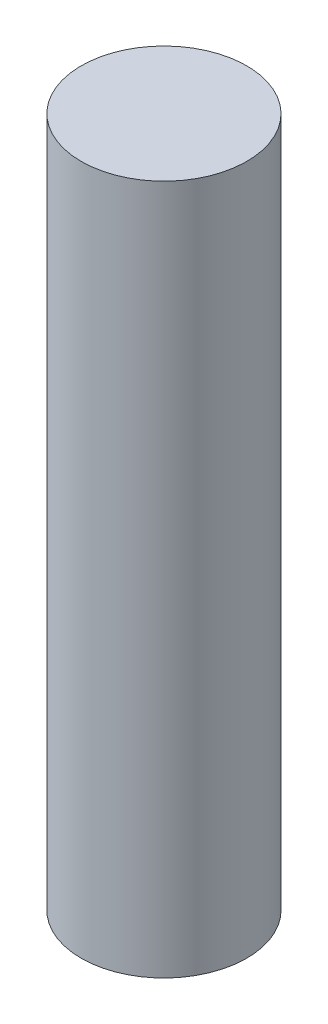
ISO-10303-21;
HEADER;
FILE_DESCRIPTION(('STEP AP214'),'2;1');
FILE_NAME('part.step','',(''),(''),'','','');
FILE_SCHEMA(('AUTOMOTIVE_DESIGN { 1 0 10303 214 1 1 1 1 }'));
ENDSEC;
DATA;
#1=APPLICATION_CONTEXT('core data for automotive mechanical design processes');
#2=APPLICATION_PROTOCOL_DEFINITION('international standard','automotive_design',2000,#1);
#3=PRODUCT_CONTEXT('',#1,'mechanical');
#4=PRODUCT('Part','Part','',(#3));
#5=PRODUCT_RELATED_PRODUCT_CATEGORY('part','',(#4));
#6=PRODUCT_DEFINITION_FORMATION('','',#4);
#7=PRODUCT_DEFINITION_CONTEXT('part definition',#1,'design');
#8=PRODUCT_DEFINITION('design','',#6,#7);
#9=PRODUCT_DEFINITION_SHAPE('','',#8);
#10=(LENGTH_UNIT() NAMED_UNIT(*) SI_UNIT(.MILLI.,.METRE.));
#11=(NAMED_UNIT(*) PLANE_ANGLE_UNIT() SI_UNIT($,.RADIAN.));
#12=(NAMED_UNIT(*) SI_UNIT($,.STERADIAN.) SOLID_ANGLE_UNIT());
#13=UNCERTAINTY_MEASURE_WITH_UNIT(LENGTH_MEASURE(1.E-05),#10,'distance_accuracy_value','');
#14=(GEOMETRIC_REPRESENTATION_CONTEXT(3) GLOBAL_UNCERTAINTY_ASSIGNED_CONTEXT((#13)) GLOBAL_UNIT_ASSIGNED_CONTEXT((#10,
#11,#12)) REPRESENTATION_CONTEXT('',''));
#15=CARTESIAN_POINT('',(0.,0.,0.));
#16=DIRECTION('',(0.,0.,1.));
#17=DIRECTION('',(1.,0.,0.));
#18=AXIS2_PLACEMENT_3D('',#15,#16,#17);
#19=CARTESIAN_POINT('',(0.,20.,0.));
#20=DIRECTION('',(0.,-1.,0.));
#21=DIRECTION('',(0.,0.,-1.));
#22=AXIS2_PLACEMENT_3D('',#19,#20,#21);
#23=CYLINDRICAL_SURFACE('',#22,2.4);
#24=CARTESIAN_POINT('',(0.,20.,0.));
#25=DIRECTION('',(0.,1.,0.));
#26=DIRECTION('',(0.,0.,1.));
#27=AXIS2_PLACEMENT_3D('',#24,#25,#26);
#28=CIRCLE('',#27,2.4);
#29=CARTESIAN_POINT('',(0.,20.,2.4));
#30=VERTEX_POINT('',#29);
#31=EDGE_CURVE('E10',#30,#30,#28,.T.);
#32=ORIENTED_EDGE('',*,*,#31,.F.);
#33=EDGE_LOOP('',(#32));
#34=FACE_BOUND('',#33,.T.);
#35=CARTESIAN_POINT('',(0.,0.,0.));
#36=DIRECTION('',(0.,1.,0.));
#37=DIRECTION('',(0.,0.,1.));
#38=AXIS2_PLACEMENT_3D('',#35,#36,#37);
#39=CIRCLE('',#38,2.4);
#40=CARTESIAN_POINT('',(0.,0.,2.4));
#41=VERTEX_POINT('',#40);
#42=EDGE_CURVE('E34',#41,#41,#39,.T.);
#43=ORIENTED_EDGE('',*,*,#42,.T.);
#44=EDGE_LOOP('',(#43));
#45=FACE_BOUND('',#44,.T.);
#46=ADVANCED_FACE('F31',(#34,#45),#23,.T.);
#47=CARTESIAN_POINT('',(0.,20.,0.));
#48=DIRECTION('',(0.,1.,0.));
#49=DIRECTION('',(0.,0.,1.));
#50=AXIS2_PLACEMENT_3D('',#47,#48,#49);
#51=PLANE('',#50);
#52=ORIENTED_EDGE('',*,*,#31,.T.);
#53=EDGE_LOOP('',(#52));
#54=FACE_BOUND('',#53,.T.);
#55=ADVANCED_FACE('F46',(#54),#51,.T.);
#56=CARTESIAN_POINT('',(0.,0.,0.));
#57=DIRECTION('',(0.,1.,0.));
#58=DIRECTION('',(0.,0.,1.));
#59=AXIS2_PLACEMENT_3D('',#56,#57,#58);
#60=PLANE('',#59);
#61=ORIENTED_EDGE('',*,*,#42,.F.);
#62=EDGE_LOOP('',(#61));
#63=FACE_BOUND('',#62,.T.);
#64=ADVANCED_FACE('F44',(#63),#60,.F.);
#65=CLOSED_SHELL('',(#46,#55,#64));
#66=MANIFOLD_SOLID_BREP('B2',#65);
#67=ADVANCED_BREP_SHAPE_REPRESENTATION('',(#18,#66),#14);
#68=SHAPE_DEFINITION_REPRESENTATION(#9,#67);
ENDSEC;
END-ISO-10303-21;
